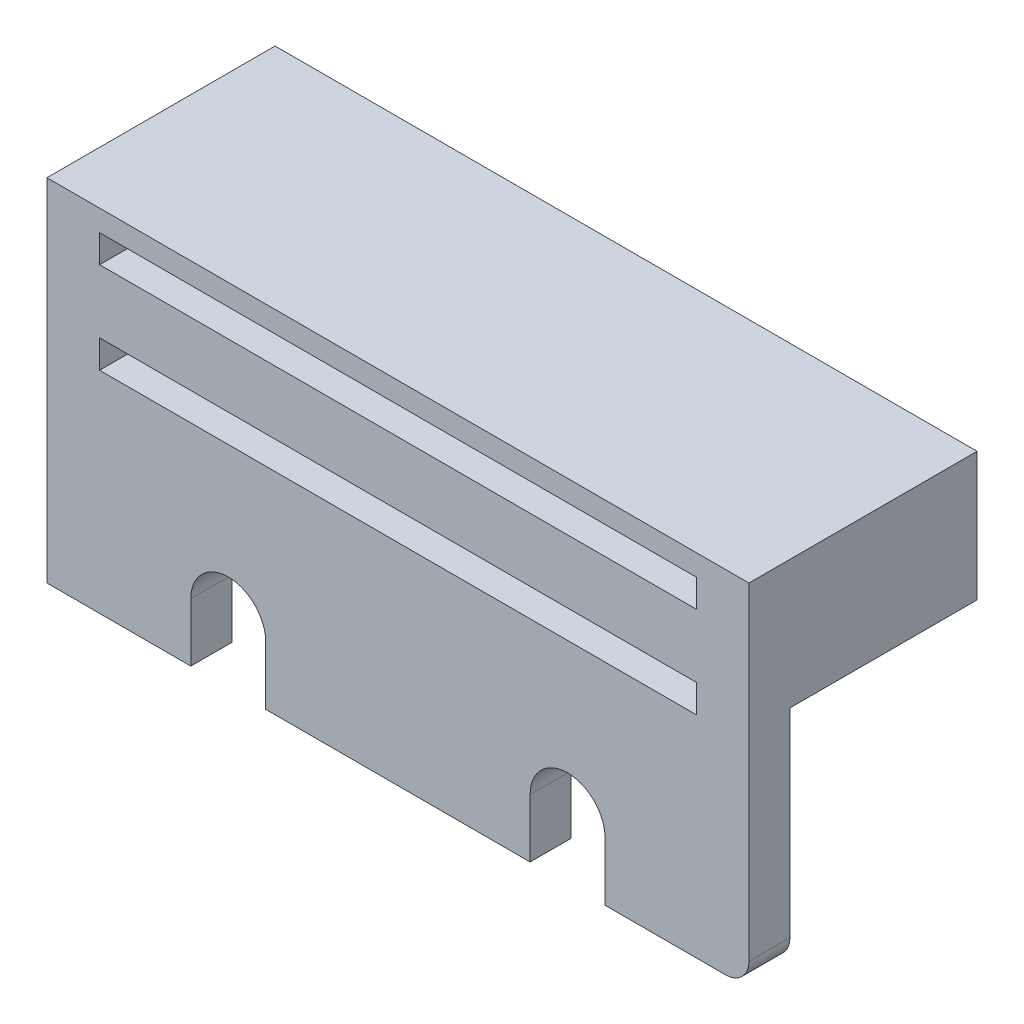
ISO-10303-21;
HEADER;
FILE_DESCRIPTION(('STEP AP214'),'2;1');
FILE_NAME('part.step','',(''),(''),'','','');
FILE_SCHEMA(('AUTOMOTIVE_DESIGN { 1 0 10303 214 1 1 1 1 }'));
ENDSEC;
DATA;
#1=APPLICATION_CONTEXT('core data for automotive mechanical design processes');
#2=APPLICATION_PROTOCOL_DEFINITION('international standard','automotive_design',2000,#1);
#3=PRODUCT_CONTEXT('',#1,'mechanical');
#4=PRODUCT('Part','Part','',(#3));
#5=PRODUCT_RELATED_PRODUCT_CATEGORY('part','',(#4));
#6=PRODUCT_DEFINITION_FORMATION('','',#4);
#7=PRODUCT_DEFINITION_CONTEXT('part definition',#1,'design');
#8=PRODUCT_DEFINITION('design','',#6,#7);
#9=PRODUCT_DEFINITION_SHAPE('','',#8);
#10=(LENGTH_UNIT() NAMED_UNIT(*) SI_UNIT(.MILLI.,.METRE.));
#11=(NAMED_UNIT(*) PLANE_ANGLE_UNIT() SI_UNIT($,.RADIAN.));
#12=(NAMED_UNIT(*) SI_UNIT($,.STERADIAN.) SOLID_ANGLE_UNIT());
#13=UNCERTAINTY_MEASURE_WITH_UNIT(LENGTH_MEASURE(1.E-05),#10,'distance_accuracy_value','');
#14=(GEOMETRIC_REPRESENTATION_CONTEXT(3) GLOBAL_UNCERTAINTY_ASSIGNED_CONTEXT((#13)) GLOBAL_UNIT_ASSIGNED_CONTEXT((#10,
#11,#12)) REPRESENTATION_CONTEXT('',''));
#15=CARTESIAN_POINT('',(0.,0.,0.));
#16=DIRECTION('',(0.,0.,1.));
#17=DIRECTION('',(1.,0.,0.));
#18=AXIS2_PLACEMENT_3D('',#15,#16,#17);
#19=CARTESIAN_POINT('',(-15.,-0.499999999999998,26.));
#20=DIRECTION('',(0.,1.,0.));
#21=DIRECTION('',(-1.,0.,0.));
#22=AXIS2_PLACEMENT_3D('',#19,#20,#21);
#23=PLANE('',#22);
#24=DIRECTION('',(1.,0.,0.));
#25=VECTOR('',#24,1.);
#26=CARTESIAN_POINT('',(-15.,-0.499999999999998,18.));
#27=LINE('',#26,#25);
#28=CARTESIAN_POINT('',(-15.,-0.499999999999998,18.));
#29=VERTEX_POINT('',#28);
#30=CARTESIAN_POINT('',(-12.75,-0.499999999999994,17.9999999999931));
#31=VERTEX_POINT('',#30);
#32=EDGE_CURVE('E394',#29,#31,#27,.T.);
#33=ORIENTED_EDGE('',*,*,#32,.T.);
#34=DIRECTION('',(0.,0.,1.));
#35=VECTOR('',#34,1.);
#36=CARTESIAN_POINT('',(-12.75,-0.499999999999997,26.));
#37=LINE('',#36,#35);
#38=CARTESIAN_POINT('',(-12.75,-0.499999999999997,26.));
#39=VERTEX_POINT('',#38);
#40=EDGE_CURVE('E45',#31,#39,#37,.T.);
#41=ORIENTED_EDGE('',*,*,#40,.T.);
#42=DIRECTION('',(1.,0.,0.));
#43=VECTOR('',#42,1.);
#44=CARTESIAN_POINT('',(-15.,-0.499999999999998,26.));
#45=LINE('',#44,#43);
#46=CARTESIAN_POINT('',(-15.,-0.499999999999998,26.));
#47=VERTEX_POINT('',#46);
#48=EDGE_CURVE('E295',#47,#39,#45,.T.);
#49=ORIENTED_EDGE('',*,*,#48,.F.);
#50=DIRECTION('',(0.,0.,1.));
#51=VECTOR('',#50,1.);
#52=CARTESIAN_POINT('',(-15.,-0.499999999999998,26.));
#53=LINE('',#52,#51);
#54=EDGE_CURVE('E290',#29,#47,#53,.T.);
#55=ORIENTED_EDGE('',*,*,#54,.F.);
#56=EDGE_LOOP('',(#33,#41,#49,#55));
#57=FACE_BOUND('',#56,.T.);
#58=ADVANCED_FACE('F37',(#57),#23,.F.);
#59=CARTESIAN_POINT('',(0.,0.,18.));
#60=DIRECTION('',(0.,0.,1.));
#61=DIRECTION('',(1.,0.,0.));
#62=AXIS2_PLACEMENT_3D('',#59,#60,#61);
#63=PLANE('',#62);
#64=DIRECTION('',(-1.,0.,0.));
#65=VECTOR('',#64,1.);
#66=CARTESIAN_POINT('',(12.75,4.09372840298144,17.9999999999931));
#67=LINE('',#66,#65);
#68=CARTESIAN_POINT('',(12.75,4.09372840298144,17.9999999999931));
#69=VERTEX_POINT('',#68);
#70=CARTESIAN_POINT('',(-12.75,4.09372840298144,17.9999999999931));
#71=VERTEX_POINT('',#70);
#72=EDGE_CURVE('E254',#69,#71,#67,.T.);
#73=ORIENTED_EDGE('',*,*,#72,.T.);
#74=DIRECTION('',(0.,-1.,0.));
#75=VECTOR('',#74,1.);
#76=CARTESIAN_POINT('',(-12.75,4.09372840298144,17.9999999999931));
#77=LINE('',#76,#75);
#78=CARTESIAN_POINT('',(-12.75,2.90627159701856,17.9999999999931));
#79=VERTEX_POINT('',#78);
#80=EDGE_CURVE('E246',#71,#79,#77,.T.);
#81=ORIENTED_EDGE('',*,*,#80,.T.);
#82=DIRECTION('',(1.,0.,0.));
#83=VECTOR('',#82,1.);
#84=CARTESIAN_POINT('',(12.75,2.90627159701856,17.9999999999931));
#85=LINE('',#84,#83);
#86=CARTESIAN_POINT('',(12.75,2.90627159701856,18.));
#87=VERTEX_POINT('',#86);
#88=EDGE_CURVE('E249',#79,#87,#85,.T.);
#89=ORIENTED_EDGE('',*,*,#88,.T.);
#90=DIRECTION('',(0.,1.,0.));
#91=VECTOR('',#90,1.);
#92=CARTESIAN_POINT('',(12.75,4.09372840298144,17.9999999999931));
#93=LINE('',#92,#91);
#94=EDGE_CURVE('E52',#87,#69,#93,.T.);
#95=ORIENTED_EDGE('',*,*,#94,.T.);
#96=EDGE_LOOP('',(#73,#81,#89,#95));
#97=FACE_BOUND('',#96,.T.);
#98=DIRECTION('',(-1.,0.,0.));
#99=VECTOR('',#98,1.);
#100=CARTESIAN_POINT('',(12.75,0.199999999999946,17.9999999999931));
#101=LINE('',#100,#99);
#102=CARTESIAN_POINT('',(12.75,0.199999999999946,17.9999999999931));
#103=VERTEX_POINT('',#102);
#104=CARTESIAN_POINT('',(-12.75,0.199999999999943,17.9999999999931));
#105=VERTEX_POINT('',#104);
#106=EDGE_CURVE('E219',#103,#105,#101,.T.);
#107=ORIENTED_EDGE('',*,*,#106,.T.);
#108=DIRECTION('',(0.,-1.,0.));
#109=VECTOR('',#108,1.);
#110=CARTESIAN_POINT('',(-12.75,-1.00000000000006,17.9999999999931));
#111=LINE('',#110,#109);
#112=EDGE_CURVE('E230',#105,#31,#111,.T.);
#113=ORIENTED_EDGE('',*,*,#112,.T.);
#114=ORIENTED_EDGE('',*,*,#32,.F.);
#115=DIRECTION('',(0.,-1.,0.));
#116=VECTOR('',#115,1.);
#117=CARTESIAN_POINT('',(-15.,5.,18.));
#118=LINE('',#117,#116);
#119=CARTESIAN_POINT('',(-15.,5.,18.));
#120=VERTEX_POINT('',#119);
#121=EDGE_CURVE('E280',#120,#29,#118,.T.);
#122=ORIENTED_EDGE('',*,*,#121,.F.);
#123=DIRECTION('',(-1.,0.,0.));
#124=VECTOR('',#123,1.);
#125=CARTESIAN_POINT('',(-15.,5.,18.));
#126=LINE('',#125,#124);
#127=CARTESIAN_POINT('',(15.,5.,18.));
#128=VERTEX_POINT('',#127);
#129=EDGE_CURVE('E283',#128,#120,#126,.T.);
#130=ORIENTED_EDGE('',*,*,#129,.F.);
#131=DIRECTION('',(0.,1.,0.));
#132=VECTOR('',#131,1.);
#133=CARTESIAN_POINT('',(15.,5.,18.));
#134=LINE('',#133,#132);
#135=CARTESIAN_POINT('',(15.,-0.49999999999999,18.));
#136=VERTEX_POINT('',#135);
#137=EDGE_CURVE('E286',#136,#128,#134,.T.);
#138=ORIENTED_EDGE('',*,*,#137,.F.);
#139=CARTESIAN_POINT('',(12.75,-0.499999999999991,18.));
#140=VERTEX_POINT('',#139);
#141=EDGE_CURVE('E229',#140,#136,#27,.T.);
#142=ORIENTED_EDGE('',*,*,#141,.F.);
#143=DIRECTION('',(0.,1.,0.));
#144=VECTOR('',#143,1.);
#145=CARTESIAN_POINT('',(12.75,-1.00000000000005,17.9999999999931));
#146=LINE('',#145,#144);
#147=EDGE_CURVE('E208',#140,#103,#146,.T.);
#148=ORIENTED_EDGE('',*,*,#147,.T.);
#149=EDGE_LOOP('',(#107,#113,#114,#122,#130,#138,#142,#148));
#150=FACE_BOUND('',#149,.T.);
#151=ADVANCED_FACE('F227',(#97,#150),#63,.F.);
#152=CARTESIAN_POINT('',(14.,-9.,27.75));
#153=DIRECTION('',(0.,0.,-1.));
#154=DIRECTION('',(-1.,0.,0.));
#155=AXIS2_PLACEMENT_3D('',#152,#153,#154);
#156=CYLINDRICAL_SURFACE('',#155,1.);
#157=DIRECTION('',(0.,0.,-1.));
#158=VECTOR('',#157,1.);
#159=CARTESIAN_POINT('',(15.,-9.,27.75));
#160=LINE('',#159,#158);
#161=CARTESIAN_POINT('',(15.,-9.,27.75));
#162=VERTEX_POINT('',#161);
#163=CARTESIAN_POINT('',(15.,-9.,26.));
#164=VERTEX_POINT('',#163);
#165=EDGE_CURVE('E383',#162,#164,#160,.T.);
#166=ORIENTED_EDGE('',*,*,#165,.F.);
#167=CARTESIAN_POINT('',(14.,-9.,27.75));
#168=DIRECTION('',(0.,0.,1.));
#169=DIRECTION('',(1.,0.,0.));
#170=AXIS2_PLACEMENT_3D('',#167,#168,#169);
#171=CIRCLE('',#170,1.);
#172=CARTESIAN_POINT('',(14.,-10.,27.75));
#173=VERTEX_POINT('',#172);
#174=EDGE_CURVE('E392',#173,#162,#171,.T.);
#175=ORIENTED_EDGE('',*,*,#174,.F.);
#176=DIRECTION('',(0.,0.,-1.));
#177=VECTOR('',#176,1.);
#178=CARTESIAN_POINT('',(14.,-10.,27.75));
#179=LINE('',#178,#177);
#180=CARTESIAN_POINT('',(14.,-10.,26.));
#181=VERTEX_POINT('',#180);
#182=EDGE_CURVE('E389',#181,#173,#179,.F.);
#183=ORIENTED_EDGE('',*,*,#182,.F.);
#184=CARTESIAN_POINT('',(14.,-9.,26.));
#185=DIRECTION('',(0.,0.,1.));
#186=DIRECTION('',(1.,0.,0.));
#187=AXIS2_PLACEMENT_3D('',#184,#185,#186);
#188=CIRCLE('',#187,1.);
#189=EDGE_CURVE('E386',#164,#181,#188,.F.);
#190=ORIENTED_EDGE('',*,*,#189,.F.);
#191=EDGE_LOOP('',(#166,#175,#183,#190));
#192=FACE_BOUND('',#191,.T.);
#193=ADVANCED_FACE('F39',(#192),#156,.T.);
#194=CARTESIAN_POINT('',(-15.,-10.,27.75));
#195=DIRECTION('',(0.,1.,0.));
#196=DIRECTION('',(0.,0.,1.));
#197=AXIS2_PLACEMENT_3D('',#194,#195,#196);
#198=PLANE('',#197);
#199=DIRECTION('',(1.,0.,0.));
#200=VECTOR('',#199,1.);
#201=CARTESIAN_POINT('',(-15.,-10.,26.));
#202=LINE('',#201,#200);
#203=CARTESIAN_POINT('',(-15.,-10.,26.));
#204=VERTEX_POINT('',#203);
#205=CARTESIAN_POINT('',(-8.85,-10.,26.));
#206=VERTEX_POINT('',#205);
#207=EDGE_CURVE('E361',#204,#206,#202,.T.);
#208=ORIENTED_EDGE('',*,*,#207,.T.);
#209=DIRECTION('',(0.,0.,1.));
#210=VECTOR('',#209,1.);
#211=CARTESIAN_POINT('',(-8.85,-10.,27.75));
#212=LINE('',#211,#210);
#213=CARTESIAN_POINT('',(-8.85,-10.,27.75));
#214=VERTEX_POINT('',#213);
#215=EDGE_CURVE('E331',#206,#214,#212,.T.);
#216=ORIENTED_EDGE('',*,*,#215,.T.);
#217=DIRECTION('',(1.,0.,0.));
#218=VECTOR('',#217,1.);
#219=CARTESIAN_POINT('',(-15.,-10.,27.75));
#220=LINE('',#219,#218);
#221=CARTESIAN_POINT('',(-15.,-10.,27.75));
#222=VERTEX_POINT('',#221);
#223=EDGE_CURVE('E347',#222,#214,#220,.T.);
#224=ORIENTED_EDGE('',*,*,#223,.F.);
#225=DIRECTION('',(0.,0.,-1.));
#226=VECTOR('',#225,1.);
#227=CARTESIAN_POINT('',(-15.,-10.,27.75));
#228=LINE('',#227,#226);
#229=EDGE_CURVE('E350',#222,#204,#228,.T.);
#230=ORIENTED_EDGE('',*,*,#229,.T.);
#231=EDGE_LOOP('',(#208,#216,#224,#230));
#232=FACE_BOUND('',#231,.T.);
#233=ADVANCED_FACE('F411',(#232),#198,.F.);
#234=CARTESIAN_POINT('',(-5.65,-10.,27.75));
#235=VERTEX_POINT('',#234);
#236=CARTESIAN_POINT('',(5.65,-10.,27.75));
#237=VERTEX_POINT('',#236);
#238=EDGE_CURVE('E351',#235,#237,#220,.T.);
#239=ORIENTED_EDGE('',*,*,#238,.F.);
#240=DIRECTION('',(0.,0.,-1.));
#241=VECTOR('',#240,1.);
#242=CARTESIAN_POINT('',(-5.65,-10.,27.75));
#243=LINE('',#242,#241);
#244=CARTESIAN_POINT('',(-5.65,-10.,26.));
#245=VERTEX_POINT('',#244);
#246=EDGE_CURVE('E328',#235,#245,#243,.T.);
#247=ORIENTED_EDGE('',*,*,#246,.T.);
#248=CARTESIAN_POINT('',(5.65,-10.,26.));
#249=VERTEX_POINT('',#248);
#250=EDGE_CURVE('E365',#245,#249,#202,.T.);
#251=ORIENTED_EDGE('',*,*,#250,.T.);
#252=DIRECTION('',(0.,0.,1.));
#253=VECTOR('',#252,1.);
#254=CARTESIAN_POINT('',(5.65,-10.,27.75));
#255=LINE('',#254,#253);
#256=EDGE_CURVE('E325',#249,#237,#255,.T.);
#257=ORIENTED_EDGE('',*,*,#256,.T.);
#258=EDGE_LOOP('',(#239,#247,#251,#257));
#259=FACE_BOUND('',#258,.T.);
#260=ADVANCED_FACE('F488',(#259),#198,.F.);
#261=CARTESIAN_POINT('',(15.,5.,27.75));
#262=DIRECTION('',(-1.,0.,0.));
#263=DIRECTION('',(0.,-1.,0.));
#264=AXIS2_PLACEMENT_3D('',#261,#262,#263);
#265=PLANE('',#264);
#266=DIRECTION('',(0.,0.,1.));
#267=VECTOR('',#266,1.);
#268=CARTESIAN_POINT('',(15.,-0.49999999999999,26.));
#269=LINE('',#268,#267);
#270=CARTESIAN_POINT('',(15.,-0.49999999999999,26.));
#271=VERTEX_POINT('',#270);
#272=EDGE_CURVE('E289',#136,#271,#269,.T.);
#273=ORIENTED_EDGE('',*,*,#272,.F.);
#274=ORIENTED_EDGE('',*,*,#137,.T.);
#275=DIRECTION('',(0.,0.,-1.));
#276=VECTOR('',#275,1.);
#277=CARTESIAN_POINT('',(15.,5.,27.75));
#278=LINE('',#277,#276);
#279=CARTESIAN_POINT('',(15.,5.,27.75));
#280=VERTEX_POINT('',#279);
#281=EDGE_CURVE('E357',#280,#128,#278,.T.);
#282=ORIENTED_EDGE('',*,*,#281,.F.);
#283=DIRECTION('',(0.,1.,0.));
#284=VECTOR('',#283,1.);
#285=CARTESIAN_POINT('',(15.,5.,27.75));
#286=LINE('',#285,#284);
#287=EDGE_CURVE('E338',#162,#280,#286,.T.);
#288=ORIENTED_EDGE('',*,*,#287,.F.);
#289=ORIENTED_EDGE('',*,*,#165,.T.);
#290=DIRECTION('',(0.,-1.,0.));
#291=VECTOR('',#290,1.);
#292=CARTESIAN_POINT('',(15.,-19.25,26.));
#293=LINE('',#292,#291);
#294=EDGE_CURVE('E334',#271,#164,#293,.T.);
#295=ORIENTED_EDGE('',*,*,#294,.F.);
#296=EDGE_LOOP('',(#273,#274,#282,#288,#289,#295));
#297=FACE_BOUND('',#296,.T.);
#298=ADVANCED_FACE('F424',(#297),#265,.F.);
#299=CARTESIAN_POINT('',(-15.,5.,27.75));
#300=DIRECTION('',(0.,-1.,0.));
#301=DIRECTION('',(0.,0.,-1.));
#302=AXIS2_PLACEMENT_3D('',#299,#300,#301);
#303=PLANE('',#302);
#304=ORIENTED_EDGE('',*,*,#281,.T.);
#305=ORIENTED_EDGE('',*,*,#129,.T.);
#306=DIRECTION('',(0.,0.,-1.));
#307=VECTOR('',#306,1.);
#308=CARTESIAN_POINT('',(-15.,5.,27.75));
#309=LINE('',#308,#307);
#310=CARTESIAN_POINT('',(-15.,5.,27.75));
#311=VERTEX_POINT('',#310);
#312=EDGE_CURVE('E354',#311,#120,#309,.T.);
#313=ORIENTED_EDGE('',*,*,#312,.F.);
#314=DIRECTION('',(-1.,0.,0.));
#315=VECTOR('',#314,1.);
#316=CARTESIAN_POINT('',(-15.,5.,27.75));
#317=LINE('',#316,#315);
#318=EDGE_CURVE('E342',#280,#311,#317,.T.);
#319=ORIENTED_EDGE('',*,*,#318,.F.);
#320=EDGE_LOOP('',(#304,#305,#313,#319));
#321=FACE_BOUND('',#320,.T.);
#322=ADVANCED_FACE('F420',(#321),#303,.F.);
#323=CARTESIAN_POINT('',(-15.,5.,27.75));
#324=DIRECTION('',(1.,0.,0.));
#325=DIRECTION('',(0.,1.,0.));
#326=AXIS2_PLACEMENT_3D('',#323,#324,#325);
#327=PLANE('',#326);
#328=ORIENTED_EDGE('',*,*,#312,.T.);
#329=ORIENTED_EDGE('',*,*,#121,.T.);
#330=ORIENTED_EDGE('',*,*,#54,.T.);
#331=DIRECTION('',(0.,-1.,0.));
#332=VECTOR('',#331,1.);
#333=CARTESIAN_POINT('',(-15.,-19.25,26.));
#334=LINE('',#333,#332);
#335=EDGE_CURVE('E335',#47,#204,#334,.T.);
#336=ORIENTED_EDGE('',*,*,#335,.T.);
#337=ORIENTED_EDGE('',*,*,#229,.F.);
#338=DIRECTION('',(0.,-1.,0.));
#339=VECTOR('',#338,1.);
#340=CARTESIAN_POINT('',(-15.,5.,27.75));
#341=LINE('',#340,#339);
#342=EDGE_CURVE('E344',#311,#222,#341,.T.);
#343=ORIENTED_EDGE('',*,*,#342,.F.);
#344=EDGE_LOOP('',(#328,#329,#330,#336,#337,#343));
#345=FACE_BOUND('',#344,.T.);
#346=ADVANCED_FACE('F407',(#345),#327,.F.);
#347=CARTESIAN_POINT('',(8.85,-10.,26.));
#348=VERTEX_POINT('',#347);
#349=EDGE_CURVE('E360',#348,#181,#202,.T.);
#350=ORIENTED_EDGE('',*,*,#349,.T.);
#351=ORIENTED_EDGE('',*,*,#182,.T.);
#352=CARTESIAN_POINT('',(8.85,-10.,27.75));
#353=VERTEX_POINT('',#352);
#354=EDGE_CURVE('E346',#353,#173,#220,.T.);
#355=ORIENTED_EDGE('',*,*,#354,.F.);
#356=DIRECTION('',(0.,0.,-1.));
#357=VECTOR('',#356,1.);
#358=CARTESIAN_POINT('',(8.85,-10.,27.75));
#359=LINE('',#358,#357);
#360=EDGE_CURVE('E311',#353,#348,#359,.T.);
#361=ORIENTED_EDGE('',*,*,#360,.T.);
#362=EDGE_LOOP('',(#350,#351,#355,#361));
#363=FACE_BOUND('',#362,.T.);
#364=ADVANCED_FACE('F483',(#363),#198,.F.);
#365=CARTESIAN_POINT('',(0.,0.,27.75));
#366=DIRECTION('',(0.,0.,1.));
#367=DIRECTION('',(1.,0.,0.));
#368=AXIS2_PLACEMENT_3D('',#365,#366,#367);
#369=PLANE('',#368);
#370=DIRECTION('',(0.,-1.,0.));
#371=VECTOR('',#370,1.);
#372=CARTESIAN_POINT('',(-12.75,-1.00000000000006,27.75));
#373=LINE('',#372,#371);
#374=CARTESIAN_POINT('',(-12.75,0.199999999999943,27.75));
#375=VERTEX_POINT('',#374);
#376=CARTESIAN_POINT('',(-12.75,-1.00000000000006,27.75));
#377=VERTEX_POINT('',#376);
#378=EDGE_CURVE('E60',#375,#377,#373,.T.);
#379=ORIENTED_EDGE('',*,*,#378,.F.);
#380=DIRECTION('',(-1.,0.,0.));
#381=VECTOR('',#380,1.);
#382=CARTESIAN_POINT('',(12.75,0.199999999999946,27.75));
#383=LINE('',#382,#381);
#384=CARTESIAN_POINT('',(12.75,0.199999999999946,27.75));
#385=VERTEX_POINT('',#384);
#386=EDGE_CURVE('E232',#385,#375,#383,.T.);
#387=ORIENTED_EDGE('',*,*,#386,.F.);
#388=DIRECTION('',(0.,1.,0.));
#389=VECTOR('',#388,1.);
#390=CARTESIAN_POINT('',(12.75,-1.00000000000005,27.75));
#391=LINE('',#390,#389);
#392=CARTESIAN_POINT('',(12.75,-1.00000000000005,27.75));
#393=VERTEX_POINT('',#392);
#394=EDGE_CURVE('E211',#393,#385,#391,.T.);
#395=ORIENTED_EDGE('',*,*,#394,.F.);
#396=DIRECTION('',(1.,0.,0.));
#397=VECTOR('',#396,1.);
#398=CARTESIAN_POINT('',(12.75,-1.00000000000005,27.75));
#399=LINE('',#398,#397);
#400=EDGE_CURVE('E236',#377,#393,#399,.T.);
#401=ORIENTED_EDGE('',*,*,#400,.F.);
#402=EDGE_LOOP('',(#379,#387,#395,#401));
#403=FACE_BOUND('',#402,.T.);
#404=DIRECTION('',(0.,-1.,0.));
#405=VECTOR('',#404,1.);
#406=CARTESIAN_POINT('',(-12.75,4.09372840298144,27.75));
#407=LINE('',#406,#405);
#408=CARTESIAN_POINT('',(-12.75,4.09372840298144,27.75));
#409=VERTEX_POINT('',#408);
#410=CARTESIAN_POINT('',(-12.75,2.90627159701856,27.75));
#411=VERTEX_POINT('',#410);
#412=EDGE_CURVE('E258',#409,#411,#407,.T.);
#413=ORIENTED_EDGE('',*,*,#412,.F.);
#414=DIRECTION('',(-1.,0.,0.));
#415=VECTOR('',#414,1.);
#416=CARTESIAN_POINT('',(12.75,4.09372840298144,27.75));
#417=LINE('',#416,#415);
#418=CARTESIAN_POINT('',(12.75,4.09372840298144,27.75));
#419=VERTEX_POINT('',#418);
#420=EDGE_CURVE('E250',#419,#409,#417,.T.);
#421=ORIENTED_EDGE('',*,*,#420,.F.);
#422=DIRECTION('',(0.,1.,0.));
#423=VECTOR('',#422,1.);
#424=CARTESIAN_POINT('',(12.75,4.09372840298144,27.75));
#425=LINE('',#424,#423);
#426=CARTESIAN_POINT('',(12.75,2.90627159701856,27.75));
#427=VERTEX_POINT('',#426);
#428=EDGE_CURVE('E263',#427,#419,#425,.T.);
#429=ORIENTED_EDGE('',*,*,#428,.F.);
#430=DIRECTION('',(1.,0.,0.));
#431=VECTOR('',#430,1.);
#432=CARTESIAN_POINT('',(12.75,2.90627159701856,27.75));
#433=LINE('',#432,#431);
#434=EDGE_CURVE('E260',#411,#427,#433,.T.);
#435=ORIENTED_EDGE('',*,*,#434,.F.);
#436=EDGE_LOOP('',(#413,#421,#429,#435));
#437=FACE_BOUND('',#436,.T.);
#438=ORIENTED_EDGE('',*,*,#354,.T.);
#439=ORIENTED_EDGE('',*,*,#174,.T.);
#440=ORIENTED_EDGE('',*,*,#287,.T.);
#441=ORIENTED_EDGE('',*,*,#318,.T.);
#442=ORIENTED_EDGE('',*,*,#342,.T.);
#443=ORIENTED_EDGE('',*,*,#223,.T.);
#444=DIRECTION('',(0.,-1.,0.));
#445=VECTOR('',#444,1.);
#446=CARTESIAN_POINT('',(-8.85,-12.5,27.75));
#447=LINE('',#446,#445);
#448=CARTESIAN_POINT('',(-8.85,-7.5,27.75));
#449=VERTEX_POINT('',#448);
#450=EDGE_CURVE('E306',#449,#214,#447,.T.);
#451=ORIENTED_EDGE('',*,*,#450,.F.);
#452=CARTESIAN_POINT('',(-7.25,-7.5,27.75));
#453=DIRECTION('',(0.,0.,1.));
#454=DIRECTION('',(1.,0.,0.));
#455=AXIS2_PLACEMENT_3D('',#452,#453,#454);
#456=CIRCLE('',#455,1.6);
#457=CARTESIAN_POINT('',(-5.65,-7.5,27.75));
#458=VERTEX_POINT('',#457);
#459=EDGE_CURVE('E302',#458,#449,#456,.T.);
#460=ORIENTED_EDGE('',*,*,#459,.F.);
#461=DIRECTION('',(0.,1.,0.));
#462=VECTOR('',#461,1.);
#463=CARTESIAN_POINT('',(-5.65,-12.5,27.75));
#464=LINE('',#463,#462);
#465=EDGE_CURVE('E299',#235,#458,#464,.T.);
#466=ORIENTED_EDGE('',*,*,#465,.F.);
#467=ORIENTED_EDGE('',*,*,#238,.T.);
#468=DIRECTION('',(0.,-1.,0.));
#469=VECTOR('',#468,1.);
#470=CARTESIAN_POINT('',(5.65,-12.5,27.75));
#471=LINE('',#470,#469);
#472=CARTESIAN_POINT('',(5.65,-7.5,27.75));
#473=VERTEX_POINT('',#472);
#474=EDGE_CURVE('E318',#473,#237,#471,.T.);
#475=ORIENTED_EDGE('',*,*,#474,.F.);
#476=CARTESIAN_POINT('',(7.25,-7.49999999999999,27.75));
#477=DIRECTION('',(0.,0.,1.));
#478=DIRECTION('',(1.,0.,0.));
#479=AXIS2_PLACEMENT_3D('',#476,#477,#478);
#480=CIRCLE('',#479,1.6);
#481=CARTESIAN_POINT('',(8.85,-7.49999999999999,27.75));
#482=VERTEX_POINT('',#481);
#483=EDGE_CURVE('E315',#482,#473,#480,.T.);
#484=ORIENTED_EDGE('',*,*,#483,.F.);
#485=DIRECTION('',(0.,1.,0.));
#486=VECTOR('',#485,1.);
#487=CARTESIAN_POINT('',(8.85,-12.5,27.75));
#488=LINE('',#487,#486);
#489=EDGE_CURVE('E298',#353,#482,#488,.T.);
#490=ORIENTED_EDGE('',*,*,#489,.F.);
#491=EDGE_LOOP('',(#438,#439,#440,#441,#442,#443,#451,#460,#466,#467,#475,#484,#490));
#492=FACE_BOUND('',#491,.T.);
#493=ADVANCED_FACE('F415',(#403,#437,#492),#369,.T.);
#494=CARTESIAN_POINT('',(-15.,-19.25,26.));
#495=DIRECTION('',(0.,0.,1.));
#496=DIRECTION('',(1.,0.,0.));
#497=AXIS2_PLACEMENT_3D('',#494,#495,#496);
#498=PLANE('',#497);
#499=ORIENTED_EDGE('',*,*,#48,.T.);
#500=DIRECTION('',(0.,-1.,0.));
#501=VECTOR('',#500,1.);
#502=CARTESIAN_POINT('',(-12.75,-19.25,26.));
#503=LINE('',#502,#501);
#504=CARTESIAN_POINT('',(-12.75,-1.00000000000006,26.));
#505=VERTEX_POINT('',#504);
#506=EDGE_CURVE('E277',#39,#505,#503,.T.);
#507=ORIENTED_EDGE('',*,*,#506,.T.);
#508=DIRECTION('',(1.,0.,0.));
#509=VECTOR('',#508,1.);
#510=CARTESIAN_POINT('',(-15.,-1.00000000000006,26.));
#511=LINE('',#510,#509);
#512=CARTESIAN_POINT('',(12.75,-1.00000000000005,26.));
#513=VERTEX_POINT('',#512);
#514=EDGE_CURVE('E12',#505,#513,#511,.T.);
#515=ORIENTED_EDGE('',*,*,#514,.T.);
#516=DIRECTION('',(0.,1.,0.));
#517=VECTOR('',#516,1.);
#518=CARTESIAN_POINT('',(12.75,-19.25,26.));
#519=LINE('',#518,#517);
#520=CARTESIAN_POINT('',(12.75,-0.499999999999991,26.));
#521=VERTEX_POINT('',#520);
#522=EDGE_CURVE('E242',#513,#521,#519,.T.);
#523=ORIENTED_EDGE('',*,*,#522,.T.);
#524=EDGE_CURVE('E292',#521,#271,#45,.T.);
#525=ORIENTED_EDGE('',*,*,#524,.T.);
#526=ORIENTED_EDGE('',*,*,#294,.T.);
#527=ORIENTED_EDGE('',*,*,#189,.T.);
#528=ORIENTED_EDGE('',*,*,#349,.F.);
#529=DIRECTION('',(0.,1.,0.));
#530=VECTOR('',#529,1.);
#531=CARTESIAN_POINT('',(8.85,-19.25,26.));
#532=LINE('',#531,#530);
#533=CARTESIAN_POINT('',(8.85,-7.49999999999999,26.));
#534=VERTEX_POINT('',#533);
#535=EDGE_CURVE('E364',#348,#534,#532,.T.);
#536=ORIENTED_EDGE('',*,*,#535,.T.);
#537=CARTESIAN_POINT('',(7.25,-7.49999999999999,26.));
#538=DIRECTION('',(0.,0.,1.));
#539=DIRECTION('',(1.,0.,0.));
#540=AXIS2_PLACEMENT_3D('',#537,#538,#539);
#541=CIRCLE('',#540,1.6);
#542=CARTESIAN_POINT('',(5.65,-7.5,26.));
#543=VERTEX_POINT('',#542);
#544=EDGE_CURVE('E368',#534,#543,#541,.T.);
#545=ORIENTED_EDGE('',*,*,#544,.T.);
#546=DIRECTION('',(0.,-1.,0.));
#547=VECTOR('',#546,1.);
#548=CARTESIAN_POINT('',(5.65,-19.25,26.));
#549=LINE('',#548,#547);
#550=EDGE_CURVE('E371',#543,#249,#549,.T.);
#551=ORIENTED_EDGE('',*,*,#550,.T.);
#552=ORIENTED_EDGE('',*,*,#250,.F.);
#553=DIRECTION('',(0.,1.,0.));
#554=VECTOR('',#553,1.);
#555=CARTESIAN_POINT('',(-5.65,-19.25,26.));
#556=LINE('',#555,#554);
#557=CARTESIAN_POINT('',(-5.65,-7.49999999999999,26.));
#558=VERTEX_POINT('',#557);
#559=EDGE_CURVE('E374',#245,#558,#556,.T.);
#560=ORIENTED_EDGE('',*,*,#559,.T.);
#561=CARTESIAN_POINT('',(-7.25,-7.5,26.));
#562=DIRECTION('',(0.,0.,1.));
#563=DIRECTION('',(1.,0.,0.));
#564=AXIS2_PLACEMENT_3D('',#561,#562,#563);
#565=CIRCLE('',#564,1.6);
#566=CARTESIAN_POINT('',(-8.85,-7.5,26.));
#567=VERTEX_POINT('',#566);
#568=EDGE_CURVE('E377',#558,#567,#565,.T.);
#569=ORIENTED_EDGE('',*,*,#568,.T.);
#570=DIRECTION('',(0.,-1.,0.));
#571=VECTOR('',#570,1.);
#572=CARTESIAN_POINT('',(-8.85,-19.25,26.));
#573=LINE('',#572,#571);
#574=EDGE_CURVE('E380',#567,#206,#573,.T.);
#575=ORIENTED_EDGE('',*,*,#574,.T.);
#576=ORIENTED_EDGE('',*,*,#207,.F.);
#577=ORIENTED_EDGE('',*,*,#335,.F.);
#578=EDGE_LOOP('',(#499,#507,#515,#523,#525,#526,#527,#528,#536,#545,#551,#552,#560,#569,#575,
#576,#577));
#579=FACE_BOUND('',#578,.T.);
#580=ADVANCED_FACE('F404',(#579),#498,.F.);
#581=CARTESIAN_POINT('',(5.65,-12.5,24.75));
#582=DIRECTION('',(-1.,0.,0.));
#583=DIRECTION('',(0.,0.,1.));
#584=AXIS2_PLACEMENT_3D('',#581,#582,#583);
#585=PLANE('',#584);
#586=ORIENTED_EDGE('',*,*,#550,.F.);
#587=DIRECTION('',(0.,0.,1.));
#588=VECTOR('',#587,1.);
#589=CARTESIAN_POINT('',(5.65,-7.5,24.75));
#590=LINE('',#589,#588);
#591=EDGE_CURVE('E303',#543,#473,#590,.T.);
#592=ORIENTED_EDGE('',*,*,#591,.T.);
#593=ORIENTED_EDGE('',*,*,#474,.T.);
#594=ORIENTED_EDGE('',*,*,#256,.F.);
#595=EDGE_LOOP('',(#586,#592,#593,#594));
#596=FACE_BOUND('',#595,.T.);
#597=ADVANCED_FACE('F467',(#596),#585,.F.);
#598=CARTESIAN_POINT('',(7.25,-7.49999999999999,24.75));
#599=DIRECTION('',(0.,0.,1.));
#600=DIRECTION('',(1.,0.,0.));
#601=AXIS2_PLACEMENT_3D('',#598,#599,#600);
#602=CYLINDRICAL_SURFACE('',#601,1.6);
#603=DIRECTION('',(0.,0.,1.));
#604=VECTOR('',#603,1.);
#605=CARTESIAN_POINT('',(8.85,-7.49999999999999,24.75));
#606=LINE('',#605,#604);
#607=EDGE_CURVE('E320',#534,#482,#606,.T.);
#608=ORIENTED_EDGE('',*,*,#607,.T.);
#609=ORIENTED_EDGE('',*,*,#483,.T.);
#610=ORIENTED_EDGE('',*,*,#591,.F.);
#611=ORIENTED_EDGE('',*,*,#544,.F.);
#612=EDGE_LOOP('',(#608,#609,#610,#611));
#613=FACE_BOUND('',#612,.T.);
#614=ADVANCED_FACE('F470',(#613),#602,.F.);
#615=CARTESIAN_POINT('',(8.85,-12.5,24.75));
#616=DIRECTION('',(1.,0.,0.));
#617=DIRECTION('',(0.,0.,-1.));
#618=AXIS2_PLACEMENT_3D('',#615,#616,#617);
#619=PLANE('',#618);
#620=ORIENTED_EDGE('',*,*,#489,.T.);
#621=ORIENTED_EDGE('',*,*,#607,.F.);
#622=ORIENTED_EDGE('',*,*,#535,.F.);
#623=ORIENTED_EDGE('',*,*,#360,.F.);
#624=EDGE_LOOP('',(#620,#621,#622,#623));
#625=FACE_BOUND('',#624,.T.);
#626=ADVANCED_FACE('F474',(#625),#619,.F.);
#627=CARTESIAN_POINT('',(-8.85,-12.5,24.75));
#628=DIRECTION('',(-1.,0.,0.));
#629=DIRECTION('',(0.,0.,1.));
#630=AXIS2_PLACEMENT_3D('',#627,#628,#629);
#631=PLANE('',#630);
#632=ORIENTED_EDGE('',*,*,#574,.F.);
#633=DIRECTION('',(0.,0.,1.));
#634=VECTOR('',#633,1.);
#635=CARTESIAN_POINT('',(-8.85,-7.5,24.75));
#636=LINE('',#635,#634);
#637=EDGE_CURVE('E309',#567,#449,#636,.T.);
#638=ORIENTED_EDGE('',*,*,#637,.T.);
#639=ORIENTED_EDGE('',*,*,#450,.T.);
#640=ORIENTED_EDGE('',*,*,#215,.F.);
#641=EDGE_LOOP('',(#632,#638,#639,#640));
#642=FACE_BOUND('',#641,.T.);
#643=ADVANCED_FACE('F463',(#642),#631,.F.);
#644=CARTESIAN_POINT('',(-7.25,-7.5,24.75));
#645=DIRECTION('',(0.,0.,1.));
#646=DIRECTION('',(1.,0.,0.));
#647=AXIS2_PLACEMENT_3D('',#644,#645,#646);
#648=CYLINDRICAL_SURFACE('',#647,1.6);
#649=DIRECTION('',(0.,0.,1.));
#650=VECTOR('',#649,1.);
#651=CARTESIAN_POINT('',(-5.65,-7.5,24.75));
#652=LINE('',#651,#650);
#653=EDGE_CURVE('E308',#558,#458,#652,.T.);
#654=ORIENTED_EDGE('',*,*,#653,.T.);
#655=ORIENTED_EDGE('',*,*,#459,.T.);
#656=ORIENTED_EDGE('',*,*,#637,.F.);
#657=ORIENTED_EDGE('',*,*,#568,.F.);
#658=EDGE_LOOP('',(#654,#655,#656,#657));
#659=FACE_BOUND('',#658,.T.);
#660=ADVANCED_FACE('F457',(#659),#648,.F.);
#661=CARTESIAN_POINT('',(-5.65,-12.5,24.75));
#662=DIRECTION('',(1.,0.,0.));
#663=DIRECTION('',(0.,0.,-1.));
#664=AXIS2_PLACEMENT_3D('',#661,#662,#663);
#665=PLANE('',#664);
#666=ORIENTED_EDGE('',*,*,#465,.T.);
#667=ORIENTED_EDGE('',*,*,#653,.F.);
#668=ORIENTED_EDGE('',*,*,#559,.F.);
#669=ORIENTED_EDGE('',*,*,#246,.F.);
#670=EDGE_LOOP('',(#666,#667,#668,#669));
#671=FACE_BOUND('',#670,.T.);
#672=ADVANCED_FACE('F453',(#671),#665,.F.);
#673=ORIENTED_EDGE('',*,*,#524,.F.);
#674=DIRECTION('',(0.,0.,-1.));
#675=VECTOR('',#674,1.);
#676=CARTESIAN_POINT('',(12.75,-0.499999999999991,26.));
#677=LINE('',#676,#675);
#678=EDGE_CURVE('E397',#521,#140,#677,.T.);
#679=ORIENTED_EDGE('',*,*,#678,.T.);
#680=ORIENTED_EDGE('',*,*,#141,.T.);
#681=ORIENTED_EDGE('',*,*,#272,.T.);
#682=EDGE_LOOP('',(#673,#679,#680,#681));
#683=FACE_BOUND('',#682,.T.);
#684=ADVANCED_FACE('F429',(#683),#23,.F.);
#685=CARTESIAN_POINT('',(12.75,-1.00000000000005,17.9999999999931));
#686=DIRECTION('',(0.,-1.,0.));
#687=DIRECTION('',(1.,0.,0.));
#688=AXIS2_PLACEMENT_3D('',#685,#686,#687);
#689=PLANE('',#688);
#690=DIRECTION('',(0.,0.,1.));
#691=VECTOR('',#690,1.);
#692=CARTESIAN_POINT('',(-12.75,-1.00000000000006,17.9999999999931));
#693=LINE('',#692,#691);
#694=EDGE_CURVE('E224',#505,#377,#693,.T.);
#695=ORIENTED_EDGE('',*,*,#694,.T.);
#696=ORIENTED_EDGE('',*,*,#400,.T.);
#697=DIRECTION('',(0.,0.,1.));
#698=VECTOR('',#697,1.);
#699=CARTESIAN_POINT('',(12.75,-1.00000000000005,17.9999999999931));
#700=LINE('',#699,#698);
#701=EDGE_CURVE('E216',#513,#393,#700,.T.);
#702=ORIENTED_EDGE('',*,*,#701,.F.);
#703=ORIENTED_EDGE('',*,*,#514,.F.);
#704=EDGE_LOOP('',(#695,#696,#702,#703));
#705=FACE_BOUND('',#704,.T.);
#706=ADVANCED_FACE('F432',(#705),#689,.F.);
#707=CARTESIAN_POINT('',(-12.75,-1.00000000000006,17.9999999999931));
#708=DIRECTION('',(-1.,0.,0.));
#709=DIRECTION('',(0.,0.,1.));
#710=AXIS2_PLACEMENT_3D('',#707,#708,#709);
#711=PLANE('',#710);
#712=ORIENTED_EDGE('',*,*,#40,.F.);
#713=ORIENTED_EDGE('',*,*,#112,.F.);
#714=DIRECTION('',(0.,0.,1.));
#715=VECTOR('',#714,1.);
#716=CARTESIAN_POINT('',(-12.75,0.199999999999943,17.9999999999931));
#717=LINE('',#716,#715);
#718=EDGE_CURVE('E215',#105,#375,#717,.T.);
#719=ORIENTED_EDGE('',*,*,#718,.T.);
#720=ORIENTED_EDGE('',*,*,#378,.T.);
#721=ORIENTED_EDGE('',*,*,#694,.F.);
#722=ORIENTED_EDGE('',*,*,#506,.F.);
#723=EDGE_LOOP('',(#712,#713,#719,#720,#721,#722));
#724=FACE_BOUND('',#723,.T.);
#725=ADVANCED_FACE('F434',(#724),#711,.F.);
#726=CARTESIAN_POINT('',(12.75,-1.00000000000005,17.9999999999931));
#727=DIRECTION('',(1.,0.,0.));
#728=DIRECTION('',(0.,0.,-1.));
#729=AXIS2_PLACEMENT_3D('',#726,#727,#728);
#730=PLANE('',#729);
#731=ORIENTED_EDGE('',*,*,#701,.T.);
#732=ORIENTED_EDGE('',*,*,#394,.T.);
#733=DIRECTION('',(0.,0.,1.));
#734=VECTOR('',#733,1.);
#735=CARTESIAN_POINT('',(12.75,0.199999999999946,17.9999999999931));
#736=LINE('',#735,#734);
#737=EDGE_CURVE('E204',#103,#385,#736,.T.);
#738=ORIENTED_EDGE('',*,*,#737,.F.);
#739=ORIENTED_EDGE('',*,*,#147,.F.);
#740=ORIENTED_EDGE('',*,*,#678,.F.);
#741=ORIENTED_EDGE('',*,*,#522,.F.);
#742=EDGE_LOOP('',(#731,#732,#738,#739,#740,#741));
#743=FACE_BOUND('',#742,.T.);
#744=ADVANCED_FACE('F206',(#743),#730,.F.);
#745=CARTESIAN_POINT('',(12.75,0.199999999999946,17.9999999999931));
#746=DIRECTION('',(0.,1.,0.));
#747=DIRECTION('',(-1.,0.,0.));
#748=AXIS2_PLACEMENT_3D('',#745,#746,#747);
#749=PLANE('',#748);
#750=ORIENTED_EDGE('',*,*,#386,.T.);
#751=ORIENTED_EDGE('',*,*,#718,.F.);
#752=ORIENTED_EDGE('',*,*,#106,.F.);
#753=ORIENTED_EDGE('',*,*,#737,.T.);
#754=EDGE_LOOP('',(#750,#751,#752,#753));
#755=FACE_BOUND('',#754,.T.);
#756=ADVANCED_FACE('F220',(#755),#749,.F.);
#757=CARTESIAN_POINT('',(-12.75,4.09372840298144,17.9999999999931));
#758=DIRECTION('',(-1.,0.,0.));
#759=DIRECTION('',(0.,0.,1.));
#760=AXIS2_PLACEMENT_3D('',#757,#758,#759);
#761=PLANE('',#760);
#762=ORIENTED_EDGE('',*,*,#412,.T.);
#763=DIRECTION('',(0.,0.,1.));
#764=VECTOR('',#763,1.);
#765=CARTESIAN_POINT('',(-12.75,2.90627159701856,17.9999999999931));
#766=LINE('',#765,#764);
#767=EDGE_CURVE('E257',#79,#411,#766,.T.);
#768=ORIENTED_EDGE('',*,*,#767,.F.);
#769=ORIENTED_EDGE('',*,*,#80,.F.);
#770=DIRECTION('',(0.,0.,1.));
#771=VECTOR('',#770,1.);
#772=CARTESIAN_POINT('',(-12.75,4.09372840298144,17.9999999999931));
#773=LINE('',#772,#771);
#774=EDGE_CURVE('E237',#71,#409,#773,.T.);
#775=ORIENTED_EDGE('',*,*,#774,.T.);
#776=EDGE_LOOP('',(#762,#768,#769,#775));
#777=FACE_BOUND('',#776,.T.);
#778=ADVANCED_FACE('F612',(#777),#761,.F.);
#779=CARTESIAN_POINT('',(12.75,4.09372840298144,17.9999999999931));
#780=DIRECTION('',(0.,1.,0.));
#781=DIRECTION('',(0.,0.,1.));
#782=AXIS2_PLACEMENT_3D('',#779,#780,#781);
#783=PLANE('',#782);
#784=ORIENTED_EDGE('',*,*,#420,.T.);
#785=ORIENTED_EDGE('',*,*,#774,.F.);
#786=ORIENTED_EDGE('',*,*,#72,.F.);
#787=DIRECTION('',(0.,0.,1.));
#788=VECTOR('',#787,1.);
#789=CARTESIAN_POINT('',(12.75,4.09372840298144,17.9999999999931));
#790=LINE('',#789,#788);
#791=EDGE_CURVE('E269',#69,#419,#790,.T.);
#792=ORIENTED_EDGE('',*,*,#791,.T.);
#793=EDGE_LOOP('',(#784,#785,#786,#792));
#794=FACE_BOUND('',#793,.T.);
#795=ADVANCED_FACE('F621',(#794),#783,.F.);
#796=CARTESIAN_POINT('',(12.75,4.09372840298144,17.9999999999931));
#797=DIRECTION('',(1.,0.,0.));
#798=DIRECTION('',(0.,0.,-1.));
#799=AXIS2_PLACEMENT_3D('',#796,#797,#798);
#800=PLANE('',#799);
#801=ORIENTED_EDGE('',*,*,#428,.T.);
#802=ORIENTED_EDGE('',*,*,#791,.F.);
#803=ORIENTED_EDGE('',*,*,#94,.F.);
#804=DIRECTION('',(0.,0.,1.));
#805=VECTOR('',#804,1.);
#806=CARTESIAN_POINT('',(12.75,2.90627159701856,17.9999999999931));
#807=LINE('',#806,#805);
#808=EDGE_CURVE('E271',#87,#427,#807,.T.);
#809=ORIENTED_EDGE('',*,*,#808,.T.);
#810=EDGE_LOOP('',(#801,#802,#803,#809));
#811=FACE_BOUND('',#810,.T.);
#812=ADVANCED_FACE('F631',(#811),#800,.F.);
#813=CARTESIAN_POINT('',(12.75,2.90627159701856,17.9999999999931));
#814=DIRECTION('',(0.,-1.,0.));
#815=DIRECTION('',(0.,0.,-1.));
#816=AXIS2_PLACEMENT_3D('',#813,#814,#815);
#817=PLANE('',#816);
#818=ORIENTED_EDGE('',*,*,#434,.T.);
#819=ORIENTED_EDGE('',*,*,#808,.F.);
#820=ORIENTED_EDGE('',*,*,#88,.F.);
#821=ORIENTED_EDGE('',*,*,#767,.T.);
#822=EDGE_LOOP('',(#818,#819,#820,#821));
#823=FACE_BOUND('',#822,.T.);
#824=ADVANCED_FACE('F640',(#823),#817,.F.);
#825=CLOSED_SHELL('',(#58,#151,#193,#233,#260,#298,#322,#346,#364,#493,#580,#597,#614,#626,#643,
#660,#672,#684,#706,#725,#744,#756,#778,#795,#812,#824));
#826=MANIFOLD_SOLID_BREP('B2',#825);
#827=ADVANCED_BREP_SHAPE_REPRESENTATION('',(#18,#826),#14);
#828=SHAPE_DEFINITION_REPRESENTATION(#9,#827);
ENDSEC;
END-ISO-10303-21;
